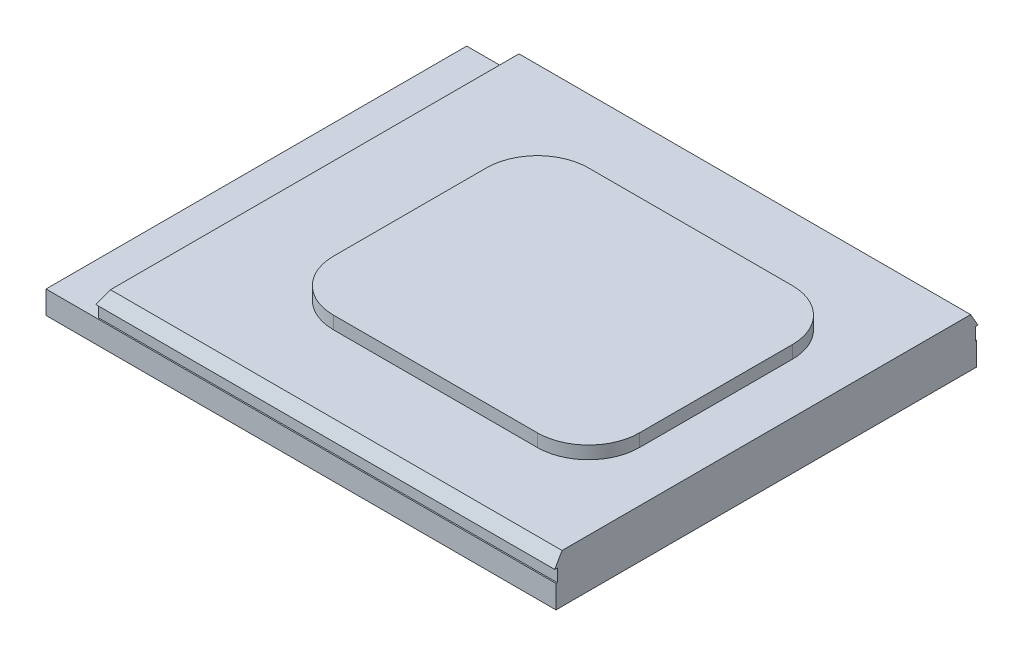
ISO-10303-21;
HEADER;
FILE_DESCRIPTION(('STEP AP214'),'2;1');
FILE_NAME('part.step','',(''),(''),'','','');
FILE_SCHEMA(('AUTOMOTIVE_DESIGN { 1 0 10303 214 1 1 1 1 }'));
ENDSEC;
DATA;
#1=APPLICATION_CONTEXT('core data for automotive mechanical design processes');
#2=APPLICATION_PROTOCOL_DEFINITION('international standard','automotive_design',2000,#1);
#3=PRODUCT_CONTEXT('',#1,'mechanical');
#4=PRODUCT('Part','Part','',(#3));
#5=PRODUCT_RELATED_PRODUCT_CATEGORY('part','',(#4));
#6=PRODUCT_DEFINITION_FORMATION('','',#4);
#7=PRODUCT_DEFINITION_CONTEXT('part definition',#1,'design');
#8=PRODUCT_DEFINITION('design','',#6,#7);
#9=PRODUCT_DEFINITION_SHAPE('','',#8);
#10=(LENGTH_UNIT() NAMED_UNIT(*) SI_UNIT(.MILLI.,.METRE.));
#11=(NAMED_UNIT(*) PLANE_ANGLE_UNIT() SI_UNIT($,.RADIAN.));
#12=(NAMED_UNIT(*) SI_UNIT($,.STERADIAN.) SOLID_ANGLE_UNIT());
#13=UNCERTAINTY_MEASURE_WITH_UNIT(LENGTH_MEASURE(1.E-05),#10,'distance_accuracy_value','');
#14=(GEOMETRIC_REPRESENTATION_CONTEXT(3) GLOBAL_UNCERTAINTY_ASSIGNED_CONTEXT((#13)) GLOBAL_UNIT_ASSIGNED_CONTEXT((#10,
#11,#12)) REPRESENTATION_CONTEXT('',''));
#15=CARTESIAN_POINT('',(0.,0.,0.));
#16=DIRECTION('',(0.,0.,1.));
#17=DIRECTION('',(1.,0.,0.));
#18=AXIS2_PLACEMENT_3D('',#15,#16,#17);
#19=CARTESIAN_POINT('',(0.,-15.5908305231151,0.));
#20=DIRECTION('',(0.,1.,0.));
#21=DIRECTION('',(0.,0.,1.));
#22=AXIS2_PLACEMENT_3D('',#19,#20,#21);
#23=PLANE('',#22);
#24=DIRECTION('',(0.,0.,1.));
#25=VECTOR('',#24,1.);
#26=CARTESIAN_POINT('',(-24.9052523703531,-15.5908305231151,10.8127386364569));
#27=LINE('',#26,#25);
#28=CARTESIAN_POINT('',(-24.9052523703531,-15.5908305231151,10.8127386364569));
#29=VERTEX_POINT('',#28);
#30=CARTESIAN_POINT('',(-24.9052523703531,-15.5908305231151,18.4327386364569));
#31=VERTEX_POINT('',#30);
#32=EDGE_CURVE('E209',#29,#31,#27,.T.);
#33=ORIENTED_EDGE('',*,*,#32,.T.);
#34=CARTESIAN_POINT('',(-22.3652523703531,-15.5908305231151,18.4327386364569));
#35=DIRECTION('',(0.,1.,0.));
#36=DIRECTION('',(0.,0.,1.));
#37=AXIS2_PLACEMENT_3D('',#34,#35,#36);
#38=CIRCLE('',#37,2.54);
#39=CARTESIAN_POINT('',(-22.3652523703531,-15.5908305231151,20.9727386364569));
#40=VERTEX_POINT('',#39);
#41=EDGE_CURVE('E195',#31,#40,#38,.T.);
#42=ORIENTED_EDGE('',*,*,#41,.T.);
#43=DIRECTION('',(1.,0.,0.));
#44=VECTOR('',#43,1.);
#45=CARTESIAN_POINT('',(-12.2052523703531,-15.5908305231151,20.9727386364569));
#46=LINE('',#45,#44);
#47=CARTESIAN_POINT('',(-12.2052523703531,-15.5908305231151,20.9727386364569));
#48=VERTEX_POINT('',#47);
#49=EDGE_CURVE('E206',#40,#48,#46,.T.);
#50=ORIENTED_EDGE('',*,*,#49,.T.);
#51=CARTESIAN_POINT('',(-12.2052523703531,-15.5908305231151,18.4327386364569));
#52=DIRECTION('',(0.,1.,0.));
#53=DIRECTION('',(0.,0.,1.));
#54=AXIS2_PLACEMENT_3D('',#51,#52,#53);
#55=CIRCLE('',#54,2.54);
#56=CARTESIAN_POINT('',(-9.66525237035306,-15.5908305231151,18.4327386364569));
#57=VERTEX_POINT('',#56);
#58=EDGE_CURVE('E213',#48,#57,#55,.T.);
#59=ORIENTED_EDGE('',*,*,#58,.T.);
#60=DIRECTION('',(0.,0.,-1.));
#61=VECTOR('',#60,1.);
#62=CARTESIAN_POINT('',(-9.66525237035305,-15.5908305231151,10.8127386364569));
#63=LINE('',#62,#61);
#64=CARTESIAN_POINT('',(-9.66525237035306,-15.5908305231151,10.8127386364569));
#65=VERTEX_POINT('',#64);
#66=EDGE_CURVE('E215',#57,#65,#63,.T.);
#67=ORIENTED_EDGE('',*,*,#66,.T.);
#68=CARTESIAN_POINT('',(-12.2052523703531,-15.5908305231151,10.8127386364569));
#69=DIRECTION('',(0.,1.,0.));
#70=DIRECTION('',(0.,0.,1.));
#71=AXIS2_PLACEMENT_3D('',#68,#69,#70);
#72=CIRCLE('',#71,2.54);
#73=CARTESIAN_POINT('',(-12.2052523703531,-15.5908305231151,8.27273863645686));
#74=VERTEX_POINT('',#73);
#75=EDGE_CURVE('E243',#65,#74,#72,.T.);
#76=ORIENTED_EDGE('',*,*,#75,.T.);
#77=DIRECTION('',(-1.,0.,0.));
#78=VECTOR('',#77,1.);
#79=CARTESIAN_POINT('',(-12.2052523703531,-15.5908305231151,8.27273863645686));
#80=LINE('',#79,#78);
#81=CARTESIAN_POINT('',(-22.365252370353,-15.5908305231151,8.27273863645686));
#82=VERTEX_POINT('',#81);
#83=EDGE_CURVE('E244',#74,#82,#80,.T.);
#84=ORIENTED_EDGE('',*,*,#83,.T.);
#85=CARTESIAN_POINT('',(-22.365252370353,-15.5908305231151,10.8127386364569));
#86=DIRECTION('',(0.,1.,0.));
#87=DIRECTION('',(0.,0.,1.));
#88=AXIS2_PLACEMENT_3D('',#85,#86,#87);
#89=CIRCLE('',#88,2.54);
#90=EDGE_CURVE('E249',#82,#29,#89,.T.);
#91=ORIENTED_EDGE('',*,*,#90,.T.);
#92=EDGE_LOOP('',(#33,#42,#50,#59,#67,#76,#84,#91));
#93=FACE_BOUND('',#92,.T.);
#94=ADVANCED_FACE('F47',(#93),#23,.T.);
#95=CARTESIAN_POINT('',(-22.3652523703531,-16.2258305231151,18.4327386364569));
#96=DIRECTION('',(0.,1.,0.));
#97=DIRECTION('',(0.,0.,1.));
#98=AXIS2_PLACEMENT_3D('',#95,#96,#97);
#99=CYLINDRICAL_SURFACE('',#98,2.54);
#100=ORIENTED_EDGE('',*,*,#41,.F.);
#101=DIRECTION('',(0.,1.,0.));
#102=VECTOR('',#101,1.);
#103=CARTESIAN_POINT('',(-24.9052523703531,-16.2258305231151,18.4327386364569));
#104=LINE('',#103,#102);
#105=CARTESIAN_POINT('',(-24.9052523703531,-16.2258305231151,18.4327386364569));
#106=VERTEX_POINT('',#105);
#107=EDGE_CURVE('E219',#106,#31,#104,.T.);
#108=ORIENTED_EDGE('',*,*,#107,.F.);
#109=CARTESIAN_POINT('',(-22.3652523703531,-16.2258305231151,18.4327386364569));
#110=DIRECTION('',(0.,-1.,0.));
#111=DIRECTION('',(0.,0.,1.));
#112=AXIS2_PLACEMENT_3D('',#109,#110,#111);
#113=CIRCLE('',#112,2.54);
#114=CARTESIAN_POINT('',(-22.3652523703531,-16.2258305231151,20.9727386364569));
#115=VERTEX_POINT('',#114);
#116=EDGE_CURVE('E87',#115,#106,#113,.T.);
#117=ORIENTED_EDGE('',*,*,#116,.F.);
#118=DIRECTION('',(0.,1.,0.));
#119=VECTOR('',#118,1.);
#120=CARTESIAN_POINT('',(-22.3652523703531,-16.2258305231151,20.9727386364569));
#121=LINE('',#120,#119);
#122=EDGE_CURVE('E51',#115,#40,#121,.T.);
#123=ORIENTED_EDGE('',*,*,#122,.T.);
#124=EDGE_LOOP('',(#100,#108,#117,#123));
#125=FACE_BOUND('',#124,.T.);
#126=ADVANCED_FACE('F194',(#125),#99,.T.);
#127=CARTESIAN_POINT('',(-24.9052523703531,-16.2258305231151,10.8127386364569));
#128=DIRECTION('',(1.,0.,0.));
#129=DIRECTION('',(0.,0.,-1.));
#130=AXIS2_PLACEMENT_3D('',#127,#128,#129);
#131=PLANE('',#130);
#132=ORIENTED_EDGE('',*,*,#32,.F.);
#133=DIRECTION('',(0.,1.,0.));
#134=VECTOR('',#133,1.);
#135=CARTESIAN_POINT('',(-24.9052523703531,-16.2258305231151,10.8127386364569));
#136=LINE('',#135,#134);
#137=CARTESIAN_POINT('',(-24.9052523703531,-16.2258305231151,10.8127386364569));
#138=VERTEX_POINT('',#137);
#139=EDGE_CURVE('E221',#138,#29,#136,.T.);
#140=ORIENTED_EDGE('',*,*,#139,.F.);
#141=DIRECTION('',(0.,0.,-1.));
#142=VECTOR('',#141,1.);
#143=CARTESIAN_POINT('',(-24.9052523703531,-16.2258305231151,10.8127386364569));
#144=LINE('',#143,#142);
#145=EDGE_CURVE('E267',#106,#138,#144,.T.);
#146=ORIENTED_EDGE('',*,*,#145,.F.);
#147=ORIENTED_EDGE('',*,*,#107,.T.);
#148=EDGE_LOOP('',(#132,#140,#146,#147));
#149=FACE_BOUND('',#148,.T.);
#150=ADVANCED_FACE('F414',(#149),#131,.F.);
#151=CARTESIAN_POINT('',(-22.365252370353,-16.2258305231151,10.8127386364569));
#152=DIRECTION('',(0.,1.,0.));
#153=DIRECTION('',(0.,0.,1.));
#154=AXIS2_PLACEMENT_3D('',#151,#152,#153);
#155=CYLINDRICAL_SURFACE('',#154,2.54);
#156=ORIENTED_EDGE('',*,*,#90,.F.);
#157=DIRECTION('',(0.,1.,0.));
#158=VECTOR('',#157,1.);
#159=CARTESIAN_POINT('',(-22.365252370353,-16.2258305231151,8.27273863645686));
#160=LINE('',#159,#158);
#161=CARTESIAN_POINT('',(-22.365252370353,-16.2258305231151,8.27273863645686));
#162=VERTEX_POINT('',#161);
#163=EDGE_CURVE('E223',#162,#82,#160,.T.);
#164=ORIENTED_EDGE('',*,*,#163,.F.);
#165=CARTESIAN_POINT('',(-22.365252370353,-16.2258305231151,10.8127386364569));
#166=DIRECTION('',(0.,-1.,0.));
#167=DIRECTION('',(0.,0.,-1.));
#168=AXIS2_PLACEMENT_3D('',#165,#166,#167);
#169=CIRCLE('',#168,2.54);
#170=EDGE_CURVE('E270',#138,#162,#169,.T.);
#171=ORIENTED_EDGE('',*,*,#170,.F.);
#172=ORIENTED_EDGE('',*,*,#139,.T.);
#173=EDGE_LOOP('',(#156,#164,#171,#172));
#174=FACE_BOUND('',#173,.T.);
#175=ADVANCED_FACE('F419',(#174),#155,.T.);
#176=CARTESIAN_POINT('',(-12.2052523703531,-16.2258305231151,8.27273863645686));
#177=DIRECTION('',(0.,0.,1.));
#178=DIRECTION('',(1.,0.,0.));
#179=AXIS2_PLACEMENT_3D('',#176,#177,#178);
#180=PLANE('',#179);
#181=ORIENTED_EDGE('',*,*,#83,.F.);
#182=DIRECTION('',(0.,1.,0.));
#183=VECTOR('',#182,1.);
#184=CARTESIAN_POINT('',(-12.2052523703531,-16.2258305231151,8.27273863645686));
#185=LINE('',#184,#183);
#186=CARTESIAN_POINT('',(-12.2052523703531,-16.2258305231151,8.27273863645686));
#187=VERTEX_POINT('',#186);
#188=EDGE_CURVE('E225',#187,#74,#185,.T.);
#189=ORIENTED_EDGE('',*,*,#188,.F.);
#190=DIRECTION('',(1.,0.,0.));
#191=VECTOR('',#190,1.);
#192=CARTESIAN_POINT('',(-12.2052523703531,-16.2258305231151,8.27273863645686));
#193=LINE('',#192,#191);
#194=EDGE_CURVE('E273',#162,#187,#193,.T.);
#195=ORIENTED_EDGE('',*,*,#194,.F.);
#196=ORIENTED_EDGE('',*,*,#163,.T.);
#197=EDGE_LOOP('',(#181,#189,#195,#196));
#198=FACE_BOUND('',#197,.T.);
#199=ADVANCED_FACE('F431',(#198),#180,.F.);
#200=CARTESIAN_POINT('',(-12.2052523703531,-16.2258305231151,10.8127386364569));
#201=DIRECTION('',(0.,1.,0.));
#202=DIRECTION('',(0.,0.,1.));
#203=AXIS2_PLACEMENT_3D('',#200,#201,#202);
#204=CYLINDRICAL_SURFACE('',#203,2.54);
#205=ORIENTED_EDGE('',*,*,#75,.F.);
#206=DIRECTION('',(0.,1.,0.));
#207=VECTOR('',#206,1.);
#208=CARTESIAN_POINT('',(-9.66525237035306,-16.2258305231151,10.8127386364569));
#209=LINE('',#208,#207);
#210=CARTESIAN_POINT('',(-9.66525237035306,-16.2258305231151,10.8127386364569));
#211=VERTEX_POINT('',#210);
#212=EDGE_CURVE('E227',#211,#65,#209,.T.);
#213=ORIENTED_EDGE('',*,*,#212,.F.);
#214=CARTESIAN_POINT('',(-12.2052523703531,-16.2258305231151,10.8127386364569));
#215=DIRECTION('',(0.,-1.,0.));
#216=DIRECTION('',(0.,0.,-1.));
#217=AXIS2_PLACEMENT_3D('',#214,#215,#216);
#218=CIRCLE('',#217,2.54);
#219=EDGE_CURVE('E276',#187,#211,#218,.T.);
#220=ORIENTED_EDGE('',*,*,#219,.F.);
#221=ORIENTED_EDGE('',*,*,#188,.T.);
#222=EDGE_LOOP('',(#205,#213,#220,#221));
#223=FACE_BOUND('',#222,.T.);
#224=ADVANCED_FACE('F428',(#223),#204,.T.);
#225=CARTESIAN_POINT('',(-9.66525237035305,-16.2258305231151,10.8127386364569));
#226=DIRECTION('',(-1.,0.,0.));
#227=DIRECTION('',(0.,0.,1.));
#228=AXIS2_PLACEMENT_3D('',#225,#226,#227);
#229=PLANE('',#228);
#230=ORIENTED_EDGE('',*,*,#66,.F.);
#231=DIRECTION('',(0.,1.,0.));
#232=VECTOR('',#231,1.);
#233=CARTESIAN_POINT('',(-9.66525237035306,-16.2258305231151,18.4327386364569));
#234=LINE('',#233,#232);
#235=CARTESIAN_POINT('',(-9.66525237035306,-16.2258305231151,18.4327386364569));
#236=VERTEX_POINT('',#235);
#237=EDGE_CURVE('E229',#236,#57,#234,.T.);
#238=ORIENTED_EDGE('',*,*,#237,.F.);
#239=DIRECTION('',(0.,0.,1.));
#240=VECTOR('',#239,1.);
#241=CARTESIAN_POINT('',(-9.66525237035305,-16.2258305231151,10.8127386364569));
#242=LINE('',#241,#240);
#243=EDGE_CURVE('E279',#211,#236,#242,.T.);
#244=ORIENTED_EDGE('',*,*,#243,.F.);
#245=ORIENTED_EDGE('',*,*,#212,.T.);
#246=EDGE_LOOP('',(#230,#238,#244,#245));
#247=FACE_BOUND('',#246,.T.);
#248=ADVANCED_FACE('F240',(#247),#229,.F.);
#249=CARTESIAN_POINT('',(-12.2052523703531,-16.2258305231151,18.4327386364569));
#250=DIRECTION('',(0.,1.,0.));
#251=DIRECTION('',(0.,0.,1.));
#252=AXIS2_PLACEMENT_3D('',#249,#250,#251);
#253=CYLINDRICAL_SURFACE('',#252,2.54);
#254=ORIENTED_EDGE('',*,*,#58,.F.);
#255=DIRECTION('',(0.,1.,0.));
#256=VECTOR('',#255,1.);
#257=CARTESIAN_POINT('',(-12.2052523703531,-16.2258305231151,20.9727386364569));
#258=LINE('',#257,#256);
#259=CARTESIAN_POINT('',(-12.2052523703531,-16.2258305231151,20.9727386364569));
#260=VERTEX_POINT('',#259);
#261=EDGE_CURVE('E202',#260,#48,#258,.T.);
#262=ORIENTED_EDGE('',*,*,#261,.F.);
#263=CARTESIAN_POINT('',(-12.2052523703531,-16.2258305231151,18.4327386364569));
#264=DIRECTION('',(0.,-1.,0.));
#265=DIRECTION('',(0.,0.,1.));
#266=AXIS2_PLACEMENT_3D('',#263,#264,#265);
#267=CIRCLE('',#266,2.54);
#268=EDGE_CURVE('E235',#236,#260,#267,.T.);
#269=ORIENTED_EDGE('',*,*,#268,.F.);
#270=ORIENTED_EDGE('',*,*,#237,.T.);
#271=EDGE_LOOP('',(#254,#262,#269,#270));
#272=FACE_BOUND('',#271,.T.);
#273=ADVANCED_FACE('F233',(#272),#253,.T.);
#274=CARTESIAN_POINT('',(-12.2052523703531,-16.2258305231151,20.9727386364569));
#275=DIRECTION('',(0.,0.,-1.));
#276=DIRECTION('',(-1.,0.,0.));
#277=AXIS2_PLACEMENT_3D('',#274,#275,#276);
#278=PLANE('',#277);
#279=ORIENTED_EDGE('',*,*,#49,.F.);
#280=ORIENTED_EDGE('',*,*,#122,.F.);
#281=DIRECTION('',(-1.,0.,0.));
#282=VECTOR('',#281,1.);
#283=CARTESIAN_POINT('',(-12.2052523703531,-16.2258305231151,20.9727386364569));
#284=LINE('',#283,#282);
#285=EDGE_CURVE('E201',#260,#115,#284,.T.);
#286=ORIENTED_EDGE('',*,*,#285,.F.);
#287=ORIENTED_EDGE('',*,*,#261,.T.);
#288=EDGE_LOOP('',(#279,#280,#286,#287));
#289=FACE_BOUND('',#288,.T.);
#290=ADVANCED_FACE('F49',(#289),#278,.F.);
#291=CARTESIAN_POINT('',(-7.15383369720603,-17.4958305231151,25.1002386364569));
#292=DIRECTION('',(0.,-1.,0.));
#293=DIRECTION('',(1.,0.,0.));
#294=AXIS2_PLACEMENT_3D('',#291,#292,#293);
#295=PLANE('',#294);
#296=DIRECTION('',(-1.,0.,0.));
#297=VECTOR('',#296,1.);
#298=CARTESIAN_POINT('',(-17.2852523703531,-17.4958305231151,4.20873863645685));
#299=LINE('',#298,#297);
#300=CARTESIAN_POINT('',(-7.15383369720603,-17.4958305231151,4.20873863645685));
#301=VERTEX_POINT('',#300);
#302=CARTESIAN_POINT('',(-30.013833697206,-17.4958305231151,4.20873863645685));
#303=VERTEX_POINT('',#302);
#304=EDGE_CURVE('E312',#301,#303,#299,.T.);
#305=ORIENTED_EDGE('',*,*,#304,.F.);
#306=DIRECTION('',(0.,0.,-1.));
#307=VECTOR('',#306,1.);
#308=CARTESIAN_POINT('',(-7.15383369720603,-17.4958305231151,25.1002386364569));
#309=LINE('',#308,#307);
#310=CARTESIAN_POINT('',(-7.15383369720603,-17.4958305231151,4.14523863645686));
#311=VERTEX_POINT('',#310);
#312=EDGE_CURVE('E343',#301,#311,#309,.T.);
#313=ORIENTED_EDGE('',*,*,#312,.T.);
#314=DIRECTION('',(-1.,0.,0.));
#315=VECTOR('',#314,1.);
#316=CARTESIAN_POINT('',(-7.15383369720603,-17.4958305231151,4.14523863645686));
#317=LINE('',#316,#315);
#318=CARTESIAN_POINT('',(-32.553833697206,-17.4958305231151,4.14523863645686));
#319=VERTEX_POINT('',#318);
#320=EDGE_CURVE('E323',#311,#319,#317,.T.);
#321=ORIENTED_EDGE('',*,*,#320,.T.);
#322=DIRECTION('',(0.,0.,-1.));
#323=VECTOR('',#322,1.);
#324=CARTESIAN_POINT('',(-32.553833697206,-17.4958305231151,25.1002386364569));
#325=LINE('',#324,#323);
#326=CARTESIAN_POINT('',(-32.553833697206,-17.4958305231151,25.1002386364569));
#327=VERTEX_POINT('',#326);
#328=EDGE_CURVE('E344',#327,#319,#325,.T.);
#329=ORIENTED_EDGE('',*,*,#328,.F.);
#330=DIRECTION('',(-1.,0.,0.));
#331=VECTOR('',#330,1.);
#332=CARTESIAN_POINT('',(-7.15383369720603,-17.4958305231151,25.1002386364569));
#333=LINE('',#332,#331);
#334=CARTESIAN_POINT('',(-7.15383369720603,-17.4958305231151,25.1002386364569));
#335=VERTEX_POINT('',#334);
#336=EDGE_CURVE('E329',#335,#327,#333,.T.);
#337=ORIENTED_EDGE('',*,*,#336,.F.);
#338=CARTESIAN_POINT('',(-7.15383369720603,-17.4958305231151,25.0367386364569));
#339=VERTEX_POINT('',#338);
#340=EDGE_CURVE('E210',#335,#339,#309,.T.);
#341=ORIENTED_EDGE('',*,*,#340,.T.);
#342=DIRECTION('',(-1.,0.,0.));
#343=VECTOR('',#342,1.);
#344=CARTESIAN_POINT('',(-17.2852523703531,-17.4958305231151,25.0367386364569));
#345=LINE('',#344,#343);
#346=CARTESIAN_POINT('',(-30.013833697206,-17.4958305231151,25.0367386364569));
#347=VERTEX_POINT('',#346);
#348=EDGE_CURVE('E301',#339,#347,#345,.T.);
#349=ORIENTED_EDGE('',*,*,#348,.T.);
#350=DIRECTION('',(0.,0.,-1.));
#351=VECTOR('',#350,1.);
#352=CARTESIAN_POINT('',(-30.013833697206,-17.4958305231151,25.0367386364569));
#353=LINE('',#352,#351);
#354=EDGE_CURVE('E307',#347,#303,#353,.T.);
#355=ORIENTED_EDGE('',*,*,#354,.T.);
#356=EDGE_LOOP('',(#305,#313,#321,#329,#337,#341,#349,#355));
#357=FACE_BOUND('',#356,.T.);
#358=ADVANCED_FACE('F365',(#357),#295,.F.);
#359=CARTESIAN_POINT('',(-7.15383369720603,-17.4958305231151,25.1002386364569));
#360=DIRECTION('',(1.,0.,0.));
#361=DIRECTION('',(0.,1.,0.));
#362=AXIS2_PLACEMENT_3D('',#359,#360,#361);
#363=PLANE('',#362);
#364=DIRECTION('',(0.,-1.,0.));
#365=VECTOR('',#364,1.);
#366=CARTESIAN_POINT('',(-7.15383369720603,-17.4958305231151,4.14523863645686));
#367=LINE('',#366,#365);
#368=CARTESIAN_POINT('',(-7.15383369720603,-18.6388305231151,4.14523863645686));
#369=VERTEX_POINT('',#368);
#370=EDGE_CURVE('E319',#311,#369,#367,.T.);
#371=ORIENTED_EDGE('',*,*,#370,.F.);
#372=ORIENTED_EDGE('',*,*,#312,.F.);
#373=DIRECTION('',(0.,-1.,0.));
#374=VECTOR('',#373,1.);
#375=CARTESIAN_POINT('',(-7.15383369720603,-8.09783052311507,4.20873863645685));
#376=LINE('',#375,#374);
#377=CARTESIAN_POINT('',(-7.15383369720603,-16.8608305231151,4.20873863645685));
#378=VERTEX_POINT('',#377);
#379=EDGE_CURVE('E298',#378,#301,#376,.T.);
#380=ORIENTED_EDGE('',*,*,#379,.F.);
#381=DIRECTION('',(0.,0.,-1.));
#382=VECTOR('',#381,1.);
#383=CARTESIAN_POINT('',(-7.15383369720603,-16.8608305231151,25.1637386364569));
#384=LINE('',#383,#382);
#385=CARTESIAN_POINT('',(-7.15383369720603,-16.8608305231151,4.08173863645686));
#386=VERTEX_POINT('',#385);
#387=EDGE_CURVE('E260',#378,#386,#384,.T.);
#388=ORIENTED_EDGE('',*,*,#387,.T.);
#389=DIRECTION('',(0.,0.866025403784439,0.5));
#390=VECTOR('',#389,1.);
#391=CARTESIAN_POINT('',(-7.15383369720603,-1.1598067418233,13.1467289431384));
#392=LINE('',#391,#390);
#393=CARTESIAN_POINT('',(-7.15383369720603,-16.2258305231151,4.44835605739227));
#394=VERTEX_POINT('',#393);
#395=EDGE_CURVE('E284',#386,#394,#392,.T.);
#396=ORIENTED_EDGE('',*,*,#395,.T.);
#397=DIRECTION('',(0.,0.,-1.));
#398=VECTOR('',#397,1.);
#399=CARTESIAN_POINT('',(-7.15383369720603,-16.2258305231151,25.1637386364569));
#400=LINE('',#399,#398);
#401=CARTESIAN_POINT('',(-7.15383369720603,-16.2258305231151,24.7971212155214));
#402=VERTEX_POINT('',#401);
#403=EDGE_CURVE('E256',#402,#394,#400,.T.);
#404=ORIENTED_EDGE('',*,*,#403,.F.);
#405=DIRECTION('',(0.,0.866025403784439,-0.5));
#406=VECTOR('',#405,1.);
#407=CARTESIAN_POINT('',(-7.15383369720603,-10.2885805231151,21.3692483297753));
#408=LINE('',#407,#406);
#409=CARTESIAN_POINT('',(-7.15383369720603,-16.8608305231151,25.1637386364569));
#410=VERTEX_POINT('',#409);
#411=EDGE_CURVE('E78',#402,#410,#408,.F.);
#412=ORIENTED_EDGE('',*,*,#411,.T.);
#413=CARTESIAN_POINT('',(-7.15383369720603,-16.8608305231151,25.0367386364569));
#414=VERTEX_POINT('',#413);
#415=EDGE_CURVE('E261',#410,#414,#384,.T.);
#416=ORIENTED_EDGE('',*,*,#415,.T.);
#417=DIRECTION('',(0.,-1.,0.));
#418=VECTOR('',#417,1.);
#419=CARTESIAN_POINT('',(-7.15383369720603,-8.09783052311507,25.0367386364569));
#420=LINE('',#419,#418);
#421=EDGE_CURVE('E304',#414,#339,#420,.T.);
#422=ORIENTED_EDGE('',*,*,#421,.T.);
#423=ORIENTED_EDGE('',*,*,#340,.F.);
#424=DIRECTION('',(0.,-1.,0.));
#425=VECTOR('',#424,1.);
#426=CARTESIAN_POINT('',(-7.15383369720603,-17.4958305231151,25.1002386364569));
#427=LINE('',#426,#425);
#428=CARTESIAN_POINT('',(-7.15383369720603,-18.6388305231151,25.1002386364569));
#429=VERTEX_POINT('',#428);
#430=EDGE_CURVE('E320',#335,#429,#427,.T.);
#431=ORIENTED_EDGE('',*,*,#430,.T.);
#432=DIRECTION('',(0.,0.,-1.));
#433=VECTOR('',#432,1.);
#434=CARTESIAN_POINT('',(-7.15383369720603,-18.6388305231151,25.1002386364569));
#435=LINE('',#434,#433);
#436=EDGE_CURVE('E331',#429,#369,#435,.T.);
#437=ORIENTED_EDGE('',*,*,#436,.T.);
#438=EDGE_LOOP('',(#371,#372,#380,#388,#396,#404,#412,#416,#422,#423,#431,#437));
#439=FACE_BOUND('',#438,.T.);
#440=ADVANCED_FACE('F351',(#439),#363,.T.);
#441=CARTESIAN_POINT('',(-32.553833697206,-17.4958305231151,25.1002386364569));
#442=DIRECTION('',(1.,0.,0.));
#443=DIRECTION('',(0.,1.,0.));
#444=AXIS2_PLACEMENT_3D('',#441,#442,#443);
#445=PLANE('',#444);
#446=DIRECTION('',(0.,-1.,0.));
#447=VECTOR('',#446,1.);
#448=CARTESIAN_POINT('',(-32.553833697206,-17.4958305231151,4.14523863645686));
#449=LINE('',#448,#447);
#450=CARTESIAN_POINT('',(-32.553833697206,-18.6388305231151,4.14523863645686));
#451=VERTEX_POINT('',#450);
#452=EDGE_CURVE('E337',#319,#451,#449,.T.);
#453=ORIENTED_EDGE('',*,*,#452,.T.);
#454=DIRECTION('',(0.,0.,-1.));
#455=VECTOR('',#454,1.);
#456=CARTESIAN_POINT('',(-32.553833697206,-18.6388305231151,25.1002386364569));
#457=LINE('',#456,#455);
#458=CARTESIAN_POINT('',(-32.553833697206,-18.6388305231151,25.1002386364569));
#459=VERTEX_POINT('',#458);
#460=EDGE_CURVE('E347',#459,#451,#457,.T.);
#461=ORIENTED_EDGE('',*,*,#460,.F.);
#462=DIRECTION('',(0.,-1.,0.));
#463=VECTOR('',#462,1.);
#464=CARTESIAN_POINT('',(-32.553833697206,-17.4958305231151,25.1002386364569));
#465=LINE('',#464,#463);
#466=EDGE_CURVE('E327',#327,#459,#465,.T.);
#467=ORIENTED_EDGE('',*,*,#466,.F.);
#468=ORIENTED_EDGE('',*,*,#328,.T.);
#469=EDGE_LOOP('',(#453,#461,#467,#468));
#470=FACE_BOUND('',#469,.T.);
#471=ADVANCED_FACE('F369',(#470),#445,.F.);
#472=CARTESIAN_POINT('',(-7.15383369720603,-18.6388305231151,25.1002386364569));
#473=DIRECTION('',(0.,-1.,0.));
#474=DIRECTION('',(1.,0.,0.));
#475=AXIS2_PLACEMENT_3D('',#472,#473,#474);
#476=PLANE('',#475);
#477=DIRECTION('',(-1.,0.,0.));
#478=VECTOR('',#477,1.);
#479=CARTESIAN_POINT('',(-7.15383369720603,-18.6388305231151,4.14523863645686));
#480=LINE('',#479,#478);
#481=EDGE_CURVE('E334',#369,#451,#480,.T.);
#482=ORIENTED_EDGE('',*,*,#481,.F.);
#483=ORIENTED_EDGE('',*,*,#436,.F.);
#484=DIRECTION('',(-1.,0.,0.));
#485=VECTOR('',#484,1.);
#486=CARTESIAN_POINT('',(-7.15383369720603,-18.6388305231151,25.1002386364569));
#487=LINE('',#486,#485);
#488=EDGE_CURVE('E324',#429,#459,#487,.T.);
#489=ORIENTED_EDGE('',*,*,#488,.T.);
#490=ORIENTED_EDGE('',*,*,#460,.T.);
#491=EDGE_LOOP('',(#482,#483,#489,#490));
#492=FACE_BOUND('',#491,.T.);
#493=ADVANCED_FACE('F356',(#492),#476,.T.);
#494=CARTESIAN_POINT('',(-17.2852523703531,-8.09783052311507,25.1002386364569));
#495=DIRECTION('',(0.,0.,-1.));
#496=DIRECTION('',(-1.,0.,0.));
#497=AXIS2_PLACEMENT_3D('',#494,#495,#496);
#498=PLANE('',#497);
#499=ORIENTED_EDGE('',*,*,#430,.F.);
#500=ORIENTED_EDGE('',*,*,#336,.T.);
#501=ORIENTED_EDGE('',*,*,#466,.T.);
#502=ORIENTED_EDGE('',*,*,#488,.F.);
#503=EDGE_LOOP('',(#499,#500,#501,#502));
#504=FACE_BOUND('',#503,.T.);
#505=ADVANCED_FACE('F371',(#504),#498,.F.);
#506=CARTESIAN_POINT('',(-17.2852523703531,-8.09783052311507,4.14523863645686));
#507=DIRECTION('',(0.,0.,-1.));
#508=DIRECTION('',(-1.,0.,0.));
#509=AXIS2_PLACEMENT_3D('',#506,#507,#508);
#510=PLANE('',#509);
#511=ORIENTED_EDGE('',*,*,#370,.T.);
#512=ORIENTED_EDGE('',*,*,#481,.T.);
#513=ORIENTED_EDGE('',*,*,#452,.F.);
#514=ORIENTED_EDGE('',*,*,#320,.F.);
#515=EDGE_LOOP('',(#511,#512,#513,#514));
#516=FACE_BOUND('',#515,.T.);
#517=ADVANCED_FACE('F361',(#516),#510,.T.);
#518=CARTESIAN_POINT('',(-30.013833697206,-8.09783052311508,25.0367386364569));
#519=DIRECTION('',(1.,0.,0.));
#520=DIRECTION('',(0.,1.,0.));
#521=AXIS2_PLACEMENT_3D('',#518,#519,#520);
#522=PLANE('',#521);
#523=DIRECTION('',(0.,-1.,0.));
#524=VECTOR('',#523,1.);
#525=CARTESIAN_POINT('',(-30.013833697206,-8.09783052311508,4.20873863645685));
#526=LINE('',#525,#524);
#527=CARTESIAN_POINT('',(-30.013833697206,-16.8608305231151,4.20873863645685));
#528=VERTEX_POINT('',#527);
#529=EDGE_CURVE('E309',#528,#303,#526,.T.);
#530=ORIENTED_EDGE('',*,*,#529,.T.);
#531=ORIENTED_EDGE('',*,*,#354,.F.);
#532=DIRECTION('',(0.,-1.,0.));
#533=VECTOR('',#532,1.);
#534=CARTESIAN_POINT('',(-30.013833697206,-8.09783052311508,25.0367386364569));
#535=LINE('',#534,#533);
#536=CARTESIAN_POINT('',(-30.013833697206,-16.8608305231151,25.0367386364569));
#537=VERTEX_POINT('',#536);
#538=EDGE_CURVE('E299',#537,#347,#535,.T.);
#539=ORIENTED_EDGE('',*,*,#538,.F.);
#540=DIRECTION('',(0.,0.,-1.));
#541=VECTOR('',#540,1.);
#542=CARTESIAN_POINT('',(-30.013833697206,-16.8608305231151,25.0367386364569));
#543=LINE('',#542,#541);
#544=EDGE_CURVE('E317',#537,#528,#543,.T.);
#545=ORIENTED_EDGE('',*,*,#544,.T.);
#546=EDGE_LOOP('',(#530,#531,#539,#545));
#547=FACE_BOUND('',#546,.T.);
#548=ADVANCED_FACE('F385',(#547),#522,.F.);
#549=CARTESIAN_POINT('',(-17.2852523703531,-8.09783052311507,25.0367386364569));
#550=DIRECTION('',(0.,0.,1.));
#551=DIRECTION('',(1.,0.,0.));
#552=AXIS2_PLACEMENT_3D('',#549,#550,#551);
#553=PLANE('',#552);
#554=DIRECTION('',(1.,0.,0.));
#555=VECTOR('',#554,1.);
#556=CARTESIAN_POINT('',(-17.2852523703531,-16.8608305231151,25.0367386364569));
#557=LINE('',#556,#555);
#558=EDGE_CURVE('E295',#537,#414,#557,.T.);
#559=ORIENTED_EDGE('',*,*,#558,.F.);
#560=ORIENTED_EDGE('',*,*,#538,.T.);
#561=ORIENTED_EDGE('',*,*,#348,.F.);
#562=ORIENTED_EDGE('',*,*,#421,.F.);
#563=EDGE_LOOP('',(#559,#560,#561,#562));
#564=FACE_BOUND('',#563,.T.);
#565=ADVANCED_FACE('F374',(#564),#553,.T.);
#566=CARTESIAN_POINT('',(-17.2852523703531,-8.09783052311507,4.20873863645685));
#567=DIRECTION('',(0.,0.,1.));
#568=DIRECTION('',(1.,0.,0.));
#569=AXIS2_PLACEMENT_3D('',#566,#567,#568);
#570=PLANE('',#569);
#571=DIRECTION('',(1.,0.,0.));
#572=VECTOR('',#571,1.);
#573=CARTESIAN_POINT('',(-17.2852523703531,-16.8608305231151,4.20873863645685));
#574=LINE('',#573,#572);
#575=EDGE_CURVE('E291',#528,#378,#574,.T.);
#576=ORIENTED_EDGE('',*,*,#575,.T.);
#577=ORIENTED_EDGE('',*,*,#379,.T.);
#578=ORIENTED_EDGE('',*,*,#304,.T.);
#579=ORIENTED_EDGE('',*,*,#529,.F.);
#580=EDGE_LOOP('',(#576,#577,#578,#579));
#581=FACE_BOUND('',#580,.T.);
#582=ADVANCED_FACE('F388',(#581),#570,.F.);
#583=CARTESIAN_POINT('',(-17.2852523703531,-16.8608305231151,25.1637386364569));
#584=DIRECTION('',(0.,1.,0.));
#585=DIRECTION('',(-1.,0.,0.));
#586=AXIS2_PLACEMENT_3D('',#583,#584,#585);
#587=PLANE('',#586);
#588=DIRECTION('',(0.,0.,-1.));
#589=VECTOR('',#588,1.);
#590=CARTESIAN_POINT('',(-30.013833697206,-16.8608305231151,25.1637386364569));
#591=LINE('',#590,#589);
#592=CARTESIAN_POINT('',(-30.013833697206,-16.8608305231151,25.1637386364569));
#593=VERTEX_POINT('',#592);
#594=EDGE_CURVE('E263',#593,#537,#591,.T.);
#595=ORIENTED_EDGE('',*,*,#594,.T.);
#596=ORIENTED_EDGE('',*,*,#558,.T.);
#597=ORIENTED_EDGE('',*,*,#415,.F.);
#598=DIRECTION('',(1.,0.,0.));
#599=VECTOR('',#598,1.);
#600=CARTESIAN_POINT('',(-17.2852523703531,-16.8608305231151,25.1637386364569));
#601=LINE('',#600,#599);
#602=EDGE_CURVE('E252',#593,#410,#601,.T.);
#603=ORIENTED_EDGE('',*,*,#602,.F.);
#604=EDGE_LOOP('',(#595,#596,#597,#603));
#605=FACE_BOUND('',#604,.T.);
#606=ADVANCED_FACE('F377',(#605),#587,.F.);
#607=ORIENTED_EDGE('',*,*,#575,.F.);
#608=CARTESIAN_POINT('',(-30.013833697206,-16.8608305231151,4.08173863645686));
#609=VERTEX_POINT('',#608);
#610=EDGE_CURVE('E66',#528,#609,#591,.T.);
#611=ORIENTED_EDGE('',*,*,#610,.T.);
#612=DIRECTION('',(1.,0.,0.));
#613=VECTOR('',#612,1.);
#614=CARTESIAN_POINT('',(-17.2852523703531,-16.8608305231151,4.08173863645686));
#615=LINE('',#614,#613);
#616=EDGE_CURVE('E255',#609,#386,#615,.T.);
#617=ORIENTED_EDGE('',*,*,#616,.T.);
#618=ORIENTED_EDGE('',*,*,#387,.F.);
#619=EDGE_LOOP('',(#607,#611,#617,#618));
#620=FACE_BOUND('',#619,.T.);
#621=ADVANCED_FACE('F391',(#620),#587,.F.);
#622=CARTESIAN_POINT('',(-17.2852523703531,-16.2258305231151,25.1637386364569));
#623=DIRECTION('',(0.,1.,0.));
#624=DIRECTION('',(0.,0.,1.));
#625=AXIS2_PLACEMENT_3D('',#622,#623,#624);
#626=PLANE('',#625);
#627=ORIENTED_EDGE('',*,*,#285,.T.);
#628=ORIENTED_EDGE('',*,*,#116,.T.);
#629=ORIENTED_EDGE('',*,*,#145,.T.);
#630=ORIENTED_EDGE('',*,*,#170,.T.);
#631=ORIENTED_EDGE('',*,*,#194,.T.);
#632=ORIENTED_EDGE('',*,*,#219,.T.);
#633=ORIENTED_EDGE('',*,*,#243,.T.);
#634=ORIENTED_EDGE('',*,*,#268,.T.);
#635=EDGE_LOOP('',(#627,#628,#629,#630,#631,#632,#633,#634));
#636=FACE_BOUND('',#635,.T.);
#637=ORIENTED_EDGE('',*,*,#403,.T.);
#638=DIRECTION('',(-1.,0.,0.));
#639=VECTOR('',#638,1.);
#640=CARTESIAN_POINT('',(-30.013833697206,-16.2258305231151,4.44835605739227));
#641=LINE('',#640,#639);
#642=CARTESIAN_POINT('',(-29.6472162762706,-16.2258305231151,4.44835605739227));
#643=VERTEX_POINT('',#642);
#644=EDGE_CURVE('E290',#394,#643,#641,.T.);
#645=ORIENTED_EDGE('',*,*,#644,.T.);
#646=DIRECTION('',(0.,0.,1.));
#647=VECTOR('',#646,1.);
#648=CARTESIAN_POINT('',(-29.6472162762706,-16.2258305231151,25.1637386364569));
#649=LINE('',#648,#647);
#650=CARTESIAN_POINT('',(-29.6472162762706,-16.2258305231151,24.7971212155214));
#651=VERTEX_POINT('',#650);
#652=EDGE_CURVE('E288',#643,#651,#649,.T.);
#653=ORIENTED_EDGE('',*,*,#652,.T.);
#654=DIRECTION('',(1.,0.,0.));
#655=VECTOR('',#654,1.);
#656=CARTESIAN_POINT('',(-17.2852523703531,-16.2258305231151,24.7971212155214));
#657=LINE('',#656,#655);
#658=EDGE_CURVE('E286',#651,#402,#657,.T.);
#659=ORIENTED_EDGE('',*,*,#658,.T.);
#660=EDGE_LOOP('',(#637,#645,#653,#659));
#661=FACE_BOUND('',#660,.T.);
#662=ADVANCED_FACE('F398',(#636,#661),#626,.T.);
#663=CARTESIAN_POINT('',(-17.2852523703531,-16.2258305231151,24.7971212155214));
#664=DIRECTION('',(0.,-0.5,-0.866025403784439));
#665=DIRECTION('',(1.,0.,0.));
#666=AXIS2_PLACEMENT_3D('',#663,#664,#665);
#667=PLANE('',#666);
#668=ORIENTED_EDGE('',*,*,#411,.F.);
#669=ORIENTED_EDGE('',*,*,#658,.F.);
#670=DIRECTION('',(0.447213595499958,0.774596669241483,-0.447213595499958));
#671=VECTOR('',#670,1.);
#672=CARTESIAN_POINT('',(-27.1748234950871,-11.9435206098387,22.3247284343379));
#673=LINE('',#672,#671);
#674=EDGE_CURVE('E57',#593,#651,#673,.T.);
#675=ORIENTED_EDGE('',*,*,#674,.F.);
#676=ORIENTED_EDGE('',*,*,#602,.T.);
#677=EDGE_LOOP('',(#668,#669,#675,#676));
#678=FACE_BOUND('',#677,.T.);
#679=ADVANCED_FACE('F401',(#678),#667,.F.);
#680=CARTESIAN_POINT('',(-30.013833697206,-16.8608305231151,25.1637386364569));
#681=DIRECTION('',(-0.866025403784439,0.5,0.));
#682=DIRECTION('',(0.,0.,1.));
#683=AXIS2_PLACEMENT_3D('',#680,#681,#682);
#684=PLANE('',#683);
#685=ORIENTED_EDGE('',*,*,#674,.T.);
#686=ORIENTED_EDGE('',*,*,#652,.F.);
#687=DIRECTION('',(-0.447213595499958,-0.774596669241483,-0.447213595499958));
#688=VECTOR('',#687,1.);
#689=CARTESIAN_POINT('',(-25.797433697206,-9.55781149808166,8.29813863645686));
#690=LINE('',#689,#688);
#691=EDGE_CURVE('E11',#609,#643,#690,.F.);
#692=ORIENTED_EDGE('',*,*,#691,.F.);
#693=ORIENTED_EDGE('',*,*,#610,.F.);
#694=ORIENTED_EDGE('',*,*,#544,.F.);
#695=ORIENTED_EDGE('',*,*,#594,.F.);
#696=EDGE_LOOP('',(#685,#686,#692,#693,#694,#695));
#697=FACE_BOUND('',#696,.T.);
#698=ADVANCED_FACE('F381',(#697),#684,.T.);
#699=CARTESIAN_POINT('',(-17.2852523703531,-16.8608305231151,4.08173863645686));
#700=DIRECTION('',(0.,0.5,-0.866025403784439));
#701=DIRECTION('',(-1.,0.,0.));
#702=AXIS2_PLACEMENT_3D('',#699,#700,#701);
#703=PLANE('',#702);
#704=ORIENTED_EDGE('',*,*,#691,.T.);
#705=ORIENTED_EDGE('',*,*,#644,.F.);
#706=ORIENTED_EDGE('',*,*,#395,.F.);
#707=ORIENTED_EDGE('',*,*,#616,.F.);
#708=EDGE_LOOP('',(#704,#705,#706,#707));
#709=FACE_BOUND('',#708,.T.);
#710=ADVANCED_FACE('F396',(#709),#703,.T.);
#711=CLOSED_SHELL('',(#94,#126,#150,#175,#199,#224,#248,#273,#290,#358,#440,#471,#493,#505,#517,
#548,#565,#582,#606,#621,#662,#679,#698,#710));
#712=MANIFOLD_SOLID_BREP('B2',#711);
#713=ADVANCED_BREP_SHAPE_REPRESENTATION('',(#18,#712),#14);
#714=SHAPE_DEFINITION_REPRESENTATION(#9,#713);
ENDSEC;
END-ISO-10303-21;
